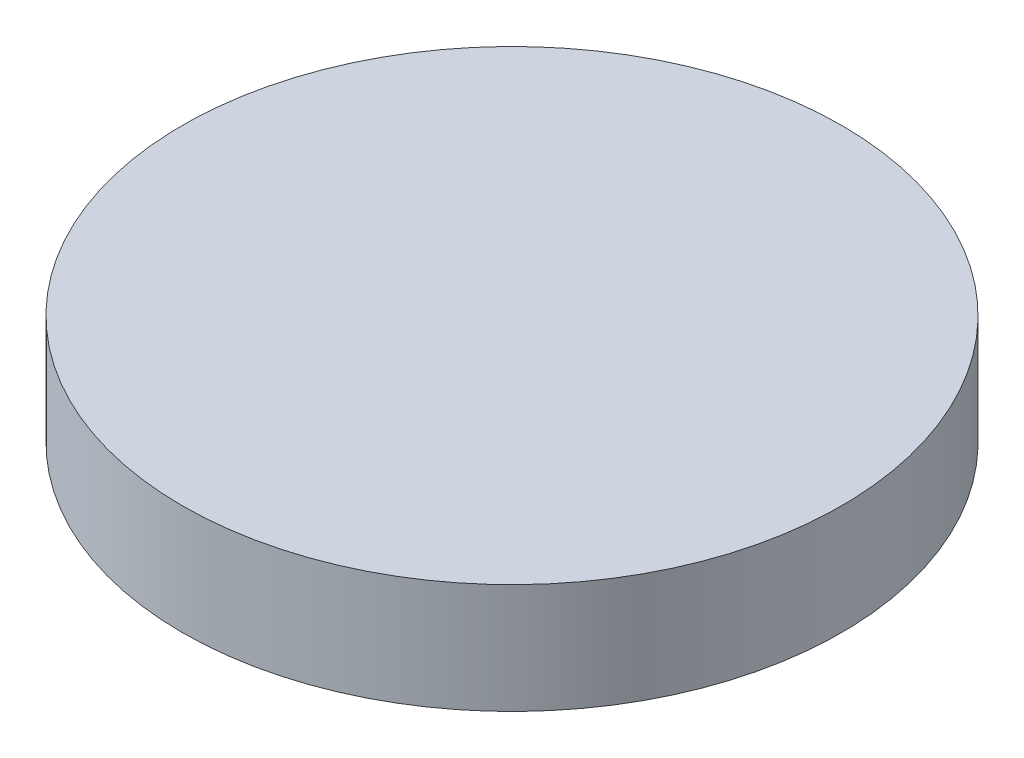
ISO-10303-21;
HEADER;
FILE_DESCRIPTION(('STEP AP214'),'2;1');
FILE_NAME('part.step','',(''),(''),'','','');
FILE_SCHEMA(('AUTOMOTIVE_DESIGN { 1 0 10303 214 1 1 1 1 }'));
ENDSEC;
DATA;
#1=APPLICATION_CONTEXT('core data for automotive mechanical design processes');
#2=APPLICATION_PROTOCOL_DEFINITION('international standard','automotive_design',2000,#1);
#3=PRODUCT_CONTEXT('',#1,'mechanical');
#4=PRODUCT('Part','Part','',(#3));
#5=PRODUCT_RELATED_PRODUCT_CATEGORY('part','',(#4));
#6=PRODUCT_DEFINITION_FORMATION('','',#4);
#7=PRODUCT_DEFINITION_CONTEXT('part definition',#1,'design');
#8=PRODUCT_DEFINITION('design','',#6,#7);
#9=PRODUCT_DEFINITION_SHAPE('','',#8);
#10=(LENGTH_UNIT() NAMED_UNIT(*) SI_UNIT(.MILLI.,.METRE.));
#11=(NAMED_UNIT(*) PLANE_ANGLE_UNIT() SI_UNIT($,.RADIAN.));
#12=(NAMED_UNIT(*) SI_UNIT($,.STERADIAN.) SOLID_ANGLE_UNIT());
#13=UNCERTAINTY_MEASURE_WITH_UNIT(LENGTH_MEASURE(1.E-05),#10,'distance_accuracy_value','');
#14=(GEOMETRIC_REPRESENTATION_CONTEXT(3) GLOBAL_UNCERTAINTY_ASSIGNED_CONTEXT((#13)) GLOBAL_UNIT_ASSIGNED_CONTEXT((#10,
#11,#12)) REPRESENTATION_CONTEXT('',''));
#15=CARTESIAN_POINT('',(0.,0.,0.));
#16=DIRECTION('',(0.,0.,1.));
#17=DIRECTION('',(1.,0.,0.));
#18=AXIS2_PLACEMENT_3D('',#15,#16,#17);
#19=CARTESIAN_POINT('',(0.,1.5875,0.));
#20=DIRECTION('',(0.,-1.,0.));
#21=DIRECTION('',(0.,0.,-1.));
#22=AXIS2_PLACEMENT_3D('',#19,#20,#21);
#23=CYLINDRICAL_SURFACE('',#22,4.7625);
#24=CARTESIAN_POINT('',(0.,1.5875,0.));
#25=DIRECTION('',(0.,1.,0.));
#26=DIRECTION('',(0.,0.,1.));
#27=AXIS2_PLACEMENT_3D('',#24,#25,#26);
#28=CIRCLE('',#27,4.7625);
#29=CARTESIAN_POINT('',(0.,1.5875,4.7625));
#30=VERTEX_POINT('',#29);
#31=EDGE_CURVE('E10',#30,#30,#28,.T.);
#32=ORIENTED_EDGE('',*,*,#31,.F.);
#33=EDGE_LOOP('',(#32));
#34=FACE_BOUND('',#33,.T.);
#35=CARTESIAN_POINT('',(0.,0.,0.));
#36=DIRECTION('',(0.,1.,0.));
#37=DIRECTION('',(0.,0.,1.));
#38=AXIS2_PLACEMENT_3D('',#35,#36,#37);
#39=CIRCLE('',#38,4.7625);
#40=CARTESIAN_POINT('',(0.,0.,4.7625));
#41=VERTEX_POINT('',#40);
#42=EDGE_CURVE('E34',#41,#41,#39,.T.);
#43=ORIENTED_EDGE('',*,*,#42,.T.);
#44=EDGE_LOOP('',(#43));
#45=FACE_BOUND('',#44,.T.);
#46=ADVANCED_FACE('F31',(#34,#45),#23,.T.);
#47=CARTESIAN_POINT('',(0.,1.5875,0.));
#48=DIRECTION('',(0.,1.,0.));
#49=DIRECTION('',(0.,0.,1.));
#50=AXIS2_PLACEMENT_3D('',#47,#48,#49);
#51=PLANE('',#50);
#52=ORIENTED_EDGE('',*,*,#31,.T.);
#53=EDGE_LOOP('',(#52));
#54=FACE_BOUND('',#53,.T.);
#55=ADVANCED_FACE('F46',(#54),#51,.T.);
#56=CARTESIAN_POINT('',(0.,0.,0.));
#57=DIRECTION('',(0.,1.,0.));
#58=DIRECTION('',(0.,0.,1.));
#59=AXIS2_PLACEMENT_3D('',#56,#57,#58);
#60=PLANE('',#59);
#61=ORIENTED_EDGE('',*,*,#42,.F.);
#62=EDGE_LOOP('',(#61));
#63=FACE_BOUND('',#62,.T.);
#64=ADVANCED_FACE('F44',(#63),#60,.F.);
#65=CLOSED_SHELL('',(#46,#55,#64));
#66=MANIFOLD_SOLID_BREP('B2',#65);
#67=ADVANCED_BREP_SHAPE_REPRESENTATION('',(#18,#66),#14);
#68=SHAPE_DEFINITION_REPRESENTATION(#9,#67);
ENDSEC;
END-ISO-10303-21;
